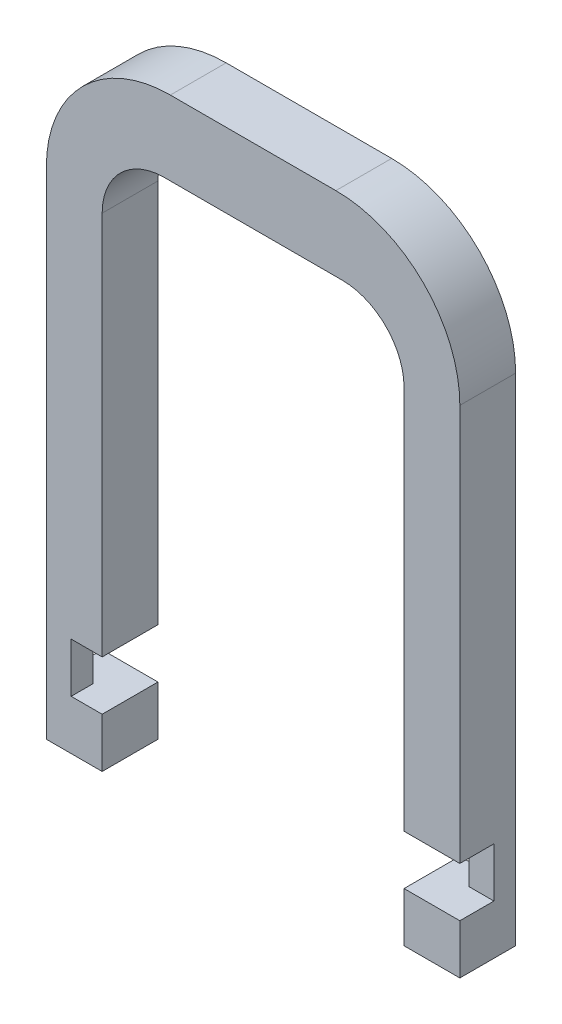
ISO-10303-21;
HEADER;
FILE_DESCRIPTION(('STEP AP214'),'2;1');
FILE_NAME('part.step','',(''),(''),'','','');
FILE_SCHEMA(('AUTOMOTIVE_DESIGN { 1 0 10303 214 1 1 1 1 }'));
ENDSEC;
DATA;
#1=APPLICATION_CONTEXT('core data for automotive mechanical design processes');
#2=APPLICATION_PROTOCOL_DEFINITION('international standard','automotive_design',2000,#1);
#3=PRODUCT_CONTEXT('',#1,'mechanical');
#4=PRODUCT('Part','Part','',(#3));
#5=PRODUCT_RELATED_PRODUCT_CATEGORY('part','',(#4));
#6=PRODUCT_DEFINITION_FORMATION('','',#4);
#7=PRODUCT_DEFINITION_CONTEXT('part definition',#1,'design');
#8=PRODUCT_DEFINITION('design','',#6,#7);
#9=PRODUCT_DEFINITION_SHAPE('','',#8);
#10=(LENGTH_UNIT() NAMED_UNIT(*) SI_UNIT(.MILLI.,.METRE.));
#11=(NAMED_UNIT(*) PLANE_ANGLE_UNIT() SI_UNIT($,.RADIAN.));
#12=(NAMED_UNIT(*) SI_UNIT($,.STERADIAN.) SOLID_ANGLE_UNIT());
#13=UNCERTAINTY_MEASURE_WITH_UNIT(LENGTH_MEASURE(1.E-05),#10,'distance_accuracy_value','');
#14=(GEOMETRIC_REPRESENTATION_CONTEXT(3) GLOBAL_UNCERTAINTY_ASSIGNED_CONTEXT((#13)) GLOBAL_UNIT_ASSIGNED_CONTEXT((#10,
#11,#12)) REPRESENTATION_CONTEXT('',''));
#15=CARTESIAN_POINT('',(0.,0.,0.));
#16=DIRECTION('',(0.,0.,1.));
#17=DIRECTION('',(1.,0.,0.));
#18=AXIS2_PLACEMENT_3D('',#15,#16,#17);
#19=CARTESIAN_POINT('',(-16.1410256410256,50.,-2.5));
#20=DIRECTION('',(-1.,0.,0.));
#21=DIRECTION('',(0.,0.,1.));
#22=AXIS2_PLACEMENT_3D('',#19,#20,#21);
#23=PLANE('',#22);
#24=DIRECTION('',(0.,-1.,0.));
#25=VECTOR('',#24,1.);
#26=CARTESIAN_POINT('',(-16.1410256410256,50.,2.));
#27=LINE('',#26,#25);
#28=CARTESIAN_POINT('',(-16.1410256410256,39.,2.));
#29=VERTEX_POINT('',#28);
#30=CARTESIAN_POINT('',(-16.1410256410256,8.,2.));
#31=VERTEX_POINT('',#30);
#32=EDGE_CURVE('E399',#29,#31,#27,.T.);
#33=ORIENTED_EDGE('',*,*,#32,.T.);
#34=DIRECTION('',(0.,0.,-1.));
#35=VECTOR('',#34,1.);
#36=CARTESIAN_POINT('',(-16.1410256410256,8.,0.25));
#37=LINE('',#36,#35);
#38=CARTESIAN_POINT('',(-16.1410256410256,8.,-2.5));
#39=VERTEX_POINT('',#38);
#40=EDGE_CURVE('E239',#31,#39,#37,.T.);
#41=ORIENTED_EDGE('',*,*,#40,.T.);
#42=DIRECTION('',(0.,-1.,0.));
#43=VECTOR('',#42,1.);
#44=CARTESIAN_POINT('',(-16.1410256410256,50.,-2.5));
#45=LINE('',#44,#43);
#46=CARTESIAN_POINT('',(-16.1410256410256,39.,-2.5));
#47=VERTEX_POINT('',#46);
#48=EDGE_CURVE('E359',#47,#39,#45,.T.);
#49=ORIENTED_EDGE('',*,*,#48,.F.);
#50=DIRECTION('',(0.,0.,-1.));
#51=VECTOR('',#50,1.);
#52=CARTESIAN_POINT('',(-16.1410256410256,39.,2.));
#53=LINE('',#52,#51);
#54=EDGE_CURVE('E322',#47,#29,#53,.F.);
#55=ORIENTED_EDGE('',*,*,#54,.T.);
#56=EDGE_LOOP('',(#33,#41,#49,#55));
#57=FACE_BOUND('',#56,.T.);
#58=ADVANCED_FACE('F33',(#57),#23,.F.);
#59=CARTESIAN_POINT('',(0.,0.,0.25));
#60=DIRECTION('',(0.,0.,-1.));
#61=DIRECTION('',(-1.,0.,0.));
#62=AXIS2_PLACEMENT_3D('',#59,#60,#61);
#63=PLANE('',#62);
#64=DIRECTION('',(1.,0.,0.));
#65=VECTOR('',#64,1.);
#66=CARTESIAN_POINT('',(-16.1410256410256,8.,0.25));
#67=LINE('',#66,#65);
#68=CARTESIAN_POINT('',(-20.6410256410256,8.,0.25));
#69=VERTEX_POINT('',#68);
#70=CARTESIAN_POINT('',(-18.6410256410256,8.,0.25));
#71=VERTEX_POINT('',#70);
#72=EDGE_CURVE('E233',#69,#71,#67,.T.);
#73=ORIENTED_EDGE('',*,*,#72,.T.);
#74=DIRECTION('',(0.,-1.,0.));
#75=VECTOR('',#74,1.);
#76=CARTESIAN_POINT('',(-18.6410256410256,0.,0.25));
#77=LINE('',#76,#75);
#78=CARTESIAN_POINT('',(-18.6410256410256,4.,0.25));
#79=VERTEX_POINT('',#78);
#80=EDGE_CURVE('E11',#71,#79,#77,.T.);
#81=ORIENTED_EDGE('',*,*,#80,.T.);
#82=DIRECTION('',(-1.,0.,0.));
#83=VECTOR('',#82,1.);
#84=CARTESIAN_POINT('',(-16.1410256410256,4.,0.25));
#85=LINE('',#84,#83);
#86=CARTESIAN_POINT('',(-20.6410256410256,4.,0.25));
#87=VERTEX_POINT('',#86);
#88=EDGE_CURVE('E198',#79,#87,#85,.T.);
#89=ORIENTED_EDGE('',*,*,#88,.T.);
#90=DIRECTION('',(0.,1.,0.));
#91=VECTOR('',#90,1.);
#92=CARTESIAN_POINT('',(-20.6410256410256,8.,0.25));
#93=LINE('',#92,#91);
#94=EDGE_CURVE('E230',#87,#69,#93,.T.);
#95=ORIENTED_EDGE('',*,*,#94,.T.);
#96=EDGE_LOOP('',(#73,#81,#89,#95));
#97=FACE_BOUND('',#96,.T.);
#98=ADVANCED_FACE('F440',(#97),#63,.T.);
#99=CARTESIAN_POINT('',(8.20897435897439,50.,-2.5));
#100=DIRECTION('',(1.,0.,0.));
#101=DIRECTION('',(0.,0.,-1.));
#102=AXIS2_PLACEMENT_3D('',#99,#100,#101);
#103=PLANE('',#102);
#104=DIRECTION('',(0.,-1.,0.));
#105=VECTOR('',#104,1.);
#106=CARTESIAN_POINT('',(8.20897435897439,50.,-2.5));
#107=LINE('',#106,#105);
#108=CARTESIAN_POINT('',(8.20897435897439,39.,-2.5));
#109=VERTEX_POINT('',#108);
#110=CARTESIAN_POINT('',(8.20897435897439,8.,-2.5));
#111=VERTEX_POINT('',#110);
#112=EDGE_CURVE('E301',#109,#111,#107,.T.);
#113=ORIENTED_EDGE('',*,*,#112,.T.);
#114=DIRECTION('',(0.,0.,1.));
#115=VECTOR('',#114,1.);
#116=CARTESIAN_POINT('',(8.20897435897439,8.,-0.75));
#117=LINE('',#116,#115);
#118=CARTESIAN_POINT('',(8.20897435897439,8.,2.));
#119=VERTEX_POINT('',#118);
#120=EDGE_CURVE('E260',#111,#119,#117,.T.);
#121=ORIENTED_EDGE('',*,*,#120,.T.);
#122=DIRECTION('',(0.,-1.,0.));
#123=VECTOR('',#122,1.);
#124=CARTESIAN_POINT('',(8.20897435897439,50.,2.));
#125=LINE('',#124,#123);
#126=CARTESIAN_POINT('',(8.20897435897439,39.,2.));
#127=VERTEX_POINT('',#126);
#128=EDGE_CURVE('E292',#127,#119,#125,.T.);
#129=ORIENTED_EDGE('',*,*,#128,.F.);
#130=DIRECTION('',(0.,0.,1.));
#131=VECTOR('',#130,1.);
#132=CARTESIAN_POINT('',(8.20897435897439,39.,-2.5));
#133=LINE('',#132,#131);
#134=EDGE_CURVE('E315',#127,#109,#133,.F.);
#135=ORIENTED_EDGE('',*,*,#134,.T.);
#136=EDGE_LOOP('',(#113,#121,#129,#135));
#137=FACE_BOUND('',#136,.T.);
#138=ADVANCED_FACE('F314',(#137),#103,.F.);
#139=CARTESIAN_POINT('',(-20.6410256410256,50.,-2.5));
#140=DIRECTION('',(0.,0.,1.));
#141=DIRECTION('',(1.,0.,0.));
#142=AXIS2_PLACEMENT_3D('',#139,#140,#141);
#143=PLANE('',#142);
#144=DIRECTION('',(0.,-1.,0.));
#145=VECTOR('',#144,1.);
#146=CARTESIAN_POINT('',(10.7089743589744,4.,-2.5));
#147=LINE('',#146,#145);
#148=CARTESIAN_POINT('',(10.7089743589744,8.,-2.5));
#149=VERTEX_POINT('',#148);
#150=CARTESIAN_POINT('',(10.7089743589744,4.,-2.5));
#151=VERTEX_POINT('',#150);
#152=EDGE_CURVE('E214',#149,#151,#147,.T.);
#153=ORIENTED_EDGE('',*,*,#152,.F.);
#154=DIRECTION('',(-1.,0.,0.));
#155=VECTOR('',#154,1.);
#156=CARTESIAN_POINT('',(10.7089743589744,8.,-2.5));
#157=LINE('',#156,#155);
#158=EDGE_CURVE('E223',#149,#111,#157,.T.);
#159=ORIENTED_EDGE('',*,*,#158,.T.);
#160=ORIENTED_EDGE('',*,*,#112,.F.);
#161=CARTESIAN_POINT('',(3.20897435897438,39.,-2.5));
#162=DIRECTION('',(0.,0.,1.));
#163=DIRECTION('',(1.,0.,0.));
#164=AXIS2_PLACEMENT_3D('',#161,#162,#163);
#165=CIRCLE('',#164,5.);
#166=CARTESIAN_POINT('',(3.20897435897438,44.,-2.5));
#167=VERTEX_POINT('',#166);
#168=EDGE_CURVE('E298',#109,#167,#165,.T.);
#169=ORIENTED_EDGE('',*,*,#168,.T.);
#170=DIRECTION('',(1.,0.,0.));
#171=VECTOR('',#170,1.);
#172=CARTESIAN_POINT('',(-16.7910256410256,44.,-2.49999999999999));
#173=LINE('',#172,#171);
#174=CARTESIAN_POINT('',(-11.1410256410256,44.,-2.5));
#175=VERTEX_POINT('',#174);
#176=EDGE_CURVE('E333',#175,#167,#173,.T.);
#177=ORIENTED_EDGE('',*,*,#176,.F.);
#178=CARTESIAN_POINT('',(-11.1410256410256,39.,-2.5));
#179=DIRECTION('',(0.,0.,1.));
#180=DIRECTION('',(1.,0.,0.));
#181=AXIS2_PLACEMENT_3D('',#178,#179,#180);
#182=CIRCLE('',#181,5.);
#183=EDGE_CURVE('E321',#175,#47,#182,.T.);
#184=ORIENTED_EDGE('',*,*,#183,.T.);
#185=ORIENTED_EDGE('',*,*,#48,.T.);
#186=DIRECTION('',(1.,0.,0.));
#187=VECTOR('',#186,1.);
#188=CARTESIAN_POINT('',(-16.1410256410256,8.,-2.5));
#189=LINE('',#188,#187);
#190=CARTESIAN_POINT('',(-20.6410256410256,8.,-2.5));
#191=VERTEX_POINT('',#190);
#192=EDGE_CURVE('E231',#191,#39,#189,.T.);
#193=ORIENTED_EDGE('',*,*,#192,.F.);
#194=DIRECTION('',(0.,-1.,0.));
#195=VECTOR('',#194,1.);
#196=CARTESIAN_POINT('',(-20.6410256410256,50.,-2.5));
#197=LINE('',#196,#195);
#198=CARTESIAN_POINT('',(-20.6410256410256,40.,-2.5));
#199=VERTEX_POINT('',#198);
#200=EDGE_CURVE('E377',#199,#191,#197,.T.);
#201=ORIENTED_EDGE('',*,*,#200,.F.);
#202=CARTESIAN_POINT('',(-10.6410256410256,40.,-2.5));
#203=DIRECTION('',(0.,0.,1.));
#204=DIRECTION('',(1.,0.,0.));
#205=AXIS2_PLACEMENT_3D('',#202,#203,#204);
#206=CIRCLE('',#205,10.);
#207=CARTESIAN_POINT('',(-10.6410256410256,50.,-2.5));
#208=VERTEX_POINT('',#207);
#209=EDGE_CURVE('E346',#199,#208,#206,.F.);
#210=ORIENTED_EDGE('',*,*,#209,.T.);
#211=DIRECTION('',(-1.,0.,0.));
#212=VECTOR('',#211,1.);
#213=CARTESIAN_POINT('',(-20.6410256410256,50.,-2.5));
#214=LINE('',#213,#212);
#215=CARTESIAN_POINT('',(2.70897435897439,50.,-2.5));
#216=VERTEX_POINT('',#215);
#217=EDGE_CURVE('E374',#216,#208,#214,.T.);
#218=ORIENTED_EDGE('',*,*,#217,.F.);
#219=CARTESIAN_POINT('',(2.70897435897439,40.,-2.5));
#220=DIRECTION('',(0.,0.,1.));
#221=DIRECTION('',(1.,0.,0.));
#222=AXIS2_PLACEMENT_3D('',#219,#220,#221);
#223=CIRCLE('',#222,10.);
#224=CARTESIAN_POINT('',(12.7089743589744,40.,-2.5));
#225=VERTEX_POINT('',#224);
#226=EDGE_CURVE('E368',#216,#225,#223,.F.);
#227=ORIENTED_EDGE('',*,*,#226,.T.);
#228=DIRECTION('',(0.,-1.,0.));
#229=VECTOR('',#228,1.);
#230=CARTESIAN_POINT('',(12.7089743589744,50.,-2.5));
#231=LINE('',#230,#229);
#232=CARTESIAN_POINT('',(12.7089743589744,0.,-2.5));
#233=VERTEX_POINT('',#232);
#234=EDGE_CURVE('E305',#225,#233,#231,.T.);
#235=ORIENTED_EDGE('',*,*,#234,.T.);
#236=DIRECTION('',(-1.,0.,0.));
#237=VECTOR('',#236,1.);
#238=CARTESIAN_POINT('',(8.20897435897439,0.,-2.5));
#239=LINE('',#238,#237);
#240=CARTESIAN_POINT('',(8.20897435897439,0.,-2.5));
#241=VERTEX_POINT('',#240);
#242=EDGE_CURVE('E272',#233,#241,#239,.T.);
#243=ORIENTED_EDGE('',*,*,#242,.T.);
#244=CARTESIAN_POINT('',(8.20897435897439,4.,-2.5));
#245=VERTEX_POINT('',#244);
#246=EDGE_CURVE('E300',#245,#241,#107,.T.);
#247=ORIENTED_EDGE('',*,*,#246,.F.);
#248=DIRECTION('',(-1.,0.,0.));
#249=VECTOR('',#248,1.);
#250=CARTESIAN_POINT('',(10.7089743589744,4.,-2.5));
#251=LINE('',#250,#249);
#252=EDGE_CURVE('E222',#151,#245,#251,.T.);
#253=ORIENTED_EDGE('',*,*,#252,.F.);
#254=EDGE_LOOP('',(#153,#159,#160,#169,#177,#184,#185,#193,#201,#210,#218,#227,#235,#243,#247,#253));
#255=FACE_BOUND('',#254,.T.);
#256=ADVANCED_FACE('F332',(#255),#143,.F.);
#257=CARTESIAN_POINT('',(-20.6410256410256,50.,2.));
#258=DIRECTION('',(0.,0.,-1.));
#259=DIRECTION('',(-1.,0.,0.));
#260=AXIS2_PLACEMENT_3D('',#257,#258,#259);
#261=PLANE('',#260);
#262=DIRECTION('',(0.,-1.,0.));
#263=VECTOR('',#262,1.);
#264=CARTESIAN_POINT('',(-18.6410256410256,8.,2.));
#265=LINE('',#264,#263);
#266=CARTESIAN_POINT('',(-18.6410256410256,8.,2.));
#267=VERTEX_POINT('',#266);
#268=CARTESIAN_POINT('',(-18.6410256410256,4.,2.));
#269=VERTEX_POINT('',#268);
#270=EDGE_CURVE('E200',#267,#269,#265,.T.);
#271=ORIENTED_EDGE('',*,*,#270,.F.);
#272=DIRECTION('',(1.,0.,0.));
#273=VECTOR('',#272,1.);
#274=CARTESIAN_POINT('',(-18.6410256410256,8.,2.));
#275=LINE('',#274,#273);
#276=EDGE_CURVE('E212',#267,#31,#275,.T.);
#277=ORIENTED_EDGE('',*,*,#276,.T.);
#278=ORIENTED_EDGE('',*,*,#32,.F.);
#279=CARTESIAN_POINT('',(-11.1410256410256,39.,2.));
#280=DIRECTION('',(0.,0.,-1.));
#281=DIRECTION('',(-1.,0.,0.));
#282=AXIS2_PLACEMENT_3D('',#279,#280,#281);
#283=CIRCLE('',#282,5.);
#284=CARTESIAN_POINT('',(-11.1410256410256,44.,2.));
#285=VERTEX_POINT('',#284);
#286=EDGE_CURVE('E323',#29,#285,#283,.T.);
#287=ORIENTED_EDGE('',*,*,#286,.T.);
#288=DIRECTION('',(1.,0.,0.));
#289=VECTOR('',#288,1.);
#290=CARTESIAN_POINT('',(-16.7910256410256,44.,2.));
#291=LINE('',#290,#289);
#292=CARTESIAN_POINT('',(3.20897435897438,44.,2.));
#293=VERTEX_POINT('',#292);
#294=EDGE_CURVE('E341',#285,#293,#291,.T.);
#295=ORIENTED_EDGE('',*,*,#294,.T.);
#296=CARTESIAN_POINT('',(3.20897435897438,39.,2.));
#297=DIRECTION('',(0.,0.,-1.));
#298=DIRECTION('',(-1.,0.,0.));
#299=AXIS2_PLACEMENT_3D('',#296,#297,#298);
#300=CIRCLE('',#299,5.);
#301=EDGE_CURVE('E311',#293,#127,#300,.T.);
#302=ORIENTED_EDGE('',*,*,#301,.T.);
#303=ORIENTED_EDGE('',*,*,#128,.T.);
#304=DIRECTION('',(-1.,0.,0.));
#305=VECTOR('',#304,1.);
#306=CARTESIAN_POINT('',(8.20897435897439,8.,2.));
#307=LINE('',#306,#305);
#308=CARTESIAN_POINT('',(12.7089743589744,8.,2.));
#309=VERTEX_POINT('',#308);
#310=EDGE_CURVE('E252',#309,#119,#307,.T.);
#311=ORIENTED_EDGE('',*,*,#310,.F.);
#312=DIRECTION('',(0.,-1.,0.));
#313=VECTOR('',#312,1.);
#314=CARTESIAN_POINT('',(12.7089743589744,50.,2.));
#315=LINE('',#314,#313);
#316=CARTESIAN_POINT('',(12.7089743589744,40.,2.));
#317=VERTEX_POINT('',#316);
#318=EDGE_CURVE('E282',#317,#309,#315,.T.);
#319=ORIENTED_EDGE('',*,*,#318,.F.);
#320=CARTESIAN_POINT('',(2.70897435897439,40.,2.));
#321=DIRECTION('',(0.,0.,-1.));
#322=DIRECTION('',(-1.,0.,0.));
#323=AXIS2_PLACEMENT_3D('',#320,#321,#322);
#324=CIRCLE('',#323,10.);
#325=CARTESIAN_POINT('',(2.70897435897439,50.,2.));
#326=VERTEX_POINT('',#325);
#327=EDGE_CURVE('E362',#317,#326,#324,.F.);
#328=ORIENTED_EDGE('',*,*,#327,.T.);
#329=DIRECTION('',(1.,0.,0.));
#330=VECTOR('',#329,1.);
#331=CARTESIAN_POINT('',(-20.6410256410256,50.,2.));
#332=LINE('',#331,#330);
#333=CARTESIAN_POINT('',(-10.6410256410256,50.,2.));
#334=VERTEX_POINT('',#333);
#335=EDGE_CURVE('E386',#334,#326,#332,.T.);
#336=ORIENTED_EDGE('',*,*,#335,.F.);
#337=CARTESIAN_POINT('',(-10.6410256410256,40.,2.));
#338=DIRECTION('',(0.,0.,-1.));
#339=DIRECTION('',(-1.,0.,0.));
#340=AXIS2_PLACEMENT_3D('',#337,#338,#339);
#341=CIRCLE('',#340,10.);
#342=CARTESIAN_POINT('',(-20.6410256410256,40.,2.));
#343=VERTEX_POINT('',#342);
#344=EDGE_CURVE('E364',#334,#343,#341,.F.);
#345=ORIENTED_EDGE('',*,*,#344,.T.);
#346=DIRECTION('',(0.,-1.,0.));
#347=VECTOR('',#346,1.);
#348=CARTESIAN_POINT('',(-20.6410256410256,50.,2.));
#349=LINE('',#348,#347);
#350=CARTESIAN_POINT('',(-20.6410256410256,0.,2.));
#351=VERTEX_POINT('',#350);
#352=EDGE_CURVE('E391',#343,#351,#349,.T.);
#353=ORIENTED_EDGE('',*,*,#352,.T.);
#354=DIRECTION('',(1.,0.,0.));
#355=VECTOR('',#354,1.);
#356=CARTESIAN_POINT('',(-20.6410256410256,0.,2.));
#357=LINE('',#356,#355);
#358=CARTESIAN_POINT('',(-16.1410256410256,0.,2.));
#359=VERTEX_POINT('',#358);
#360=EDGE_CURVE('E387',#351,#359,#357,.T.);
#361=ORIENTED_EDGE('',*,*,#360,.T.);
#362=CARTESIAN_POINT('',(-16.1410256410256,4.,2.));
#363=VERTEX_POINT('',#362);
#364=EDGE_CURVE('E211',#363,#359,#27,.T.);
#365=ORIENTED_EDGE('',*,*,#364,.F.);
#366=DIRECTION('',(1.,0.,0.));
#367=VECTOR('',#366,1.);
#368=CARTESIAN_POINT('',(-18.6410256410256,4.,2.));
#369=LINE('',#368,#367);
#370=EDGE_CURVE('E195',#269,#363,#369,.T.);
#371=ORIENTED_EDGE('',*,*,#370,.F.);
#372=EDGE_LOOP('',(#271,#277,#278,#287,#295,#302,#303,#311,#319,#328,#336,#345,#353,#361,#365,#371));
#373=FACE_BOUND('',#372,.T.);
#374=ADVANCED_FACE('F209',(#373),#261,.F.);
#375=DIRECTION('',(0.,0.,-1.));
#376=VECTOR('',#375,1.);
#377=CARTESIAN_POINT('',(-16.1410256410256,4.,0.25));
#378=LINE('',#377,#376);
#379=CARTESIAN_POINT('',(-16.1410256410256,4.,-2.5));
#380=VERTEX_POINT('',#379);
#381=EDGE_CURVE('E236',#363,#380,#378,.T.);
#382=ORIENTED_EDGE('',*,*,#381,.F.);
#383=ORIENTED_EDGE('',*,*,#364,.T.);
#384=DIRECTION('',(0.,0.,-1.));
#385=VECTOR('',#384,1.);
#386=CARTESIAN_POINT('',(-16.1410256410256,0.,-2.5));
#387=LINE('',#386,#385);
#388=CARTESIAN_POINT('',(-16.1410256410256,0.,-2.5));
#389=VERTEX_POINT('',#388);
#390=EDGE_CURVE('E340',#359,#389,#387,.T.);
#391=ORIENTED_EDGE('',*,*,#390,.T.);
#392=EDGE_CURVE('E405',#380,#389,#45,.T.);
#393=ORIENTED_EDGE('',*,*,#392,.F.);
#394=EDGE_LOOP('',(#382,#383,#391,#393));
#395=FACE_BOUND('',#394,.T.);
#396=ADVANCED_FACE('F422',(#395),#23,.F.);
#397=CARTESIAN_POINT('',(-20.6410256410256,4.,-2.5));
#398=VERTEX_POINT('',#397);
#399=CARTESIAN_POINT('',(-20.6410256410256,0.,-2.5));
#400=VERTEX_POINT('',#399);
#401=EDGE_CURVE('E398',#398,#400,#197,.T.);
#402=ORIENTED_EDGE('',*,*,#401,.F.);
#403=DIRECTION('',(-1.,0.,0.));
#404=VECTOR('',#403,1.);
#405=CARTESIAN_POINT('',(-16.1410256410256,4.,-2.5));
#406=LINE('',#405,#404);
#407=EDGE_CURVE('E226',#380,#398,#406,.T.);
#408=ORIENTED_EDGE('',*,*,#407,.F.);
#409=ORIENTED_EDGE('',*,*,#392,.T.);
#410=DIRECTION('',(-1.,0.,0.));
#411=VECTOR('',#410,1.);
#412=CARTESIAN_POINT('',(-20.6410256410256,0.,-2.5));
#413=LINE('',#412,#411);
#414=EDGE_CURVE('E415',#389,#400,#413,.T.);
#415=ORIENTED_EDGE('',*,*,#414,.T.);
#416=EDGE_LOOP('',(#402,#408,#409,#415));
#417=FACE_BOUND('',#416,.T.);
#418=ADVANCED_FACE('F414',(#417),#143,.F.);
#419=CARTESIAN_POINT('',(-20.6410256410256,50.,-2.5));
#420=DIRECTION('',(1.,0.,0.));
#421=DIRECTION('',(0.,0.,-1.));
#422=AXIS2_PLACEMENT_3D('',#419,#420,#421);
#423=PLANE('',#422);
#424=ORIENTED_EDGE('',*,*,#200,.T.);
#425=DIRECTION('',(0.,0.,-1.));
#426=VECTOR('',#425,1.);
#427=CARTESIAN_POINT('',(-20.6410256410256,8.,0.25));
#428=LINE('',#427,#426);
#429=EDGE_CURVE('E243',#69,#191,#428,.T.);
#430=ORIENTED_EDGE('',*,*,#429,.F.);
#431=ORIENTED_EDGE('',*,*,#94,.F.);
#432=DIRECTION('',(0.,0.,-1.));
#433=VECTOR('',#432,1.);
#434=CARTESIAN_POINT('',(-20.6410256410256,4.,0.25));
#435=LINE('',#434,#433);
#436=EDGE_CURVE('E245',#87,#398,#435,.T.);
#437=ORIENTED_EDGE('',*,*,#436,.T.);
#438=ORIENTED_EDGE('',*,*,#401,.T.);
#439=DIRECTION('',(0.,0.,1.));
#440=VECTOR('',#439,1.);
#441=CARTESIAN_POINT('',(-20.6410256410256,0.,-2.5));
#442=LINE('',#441,#440);
#443=EDGE_CURVE('E396',#400,#351,#442,.T.);
#444=ORIENTED_EDGE('',*,*,#443,.T.);
#445=ORIENTED_EDGE('',*,*,#352,.F.);
#446=DIRECTION('',(0.,0.,1.));
#447=VECTOR('',#446,1.);
#448=CARTESIAN_POINT('',(-20.6410256410256,40.,-2.5));
#449=LINE('',#448,#447);
#450=EDGE_CURVE('E366',#343,#199,#449,.F.);
#451=ORIENTED_EDGE('',*,*,#450,.T.);
#452=EDGE_LOOP('',(#424,#430,#431,#437,#438,#444,#445,#451));
#453=FACE_BOUND('',#452,.T.);
#454=ADVANCED_FACE('F394',(#453),#423,.F.);
#455=CARTESIAN_POINT('',(12.7089743589744,4.,2.));
#456=VERTEX_POINT('',#455);
#457=CARTESIAN_POINT('',(12.7089743589744,0.,2.));
#458=VERTEX_POINT('',#457);
#459=EDGE_CURVE('E281',#456,#458,#315,.T.);
#460=ORIENTED_EDGE('',*,*,#459,.F.);
#461=DIRECTION('',(1.,0.,0.));
#462=VECTOR('',#461,1.);
#463=CARTESIAN_POINT('',(8.20897435897439,4.,2.));
#464=LINE('',#463,#462);
#465=CARTESIAN_POINT('',(8.20897435897439,4.,2.));
#466=VERTEX_POINT('',#465);
#467=EDGE_CURVE('E242',#466,#456,#464,.T.);
#468=ORIENTED_EDGE('',*,*,#467,.F.);
#469=CARTESIAN_POINT('',(8.20897435897439,0.,2.));
#470=VERTEX_POINT('',#469);
#471=EDGE_CURVE('E285',#466,#470,#125,.T.);
#472=ORIENTED_EDGE('',*,*,#471,.T.);
#473=DIRECTION('',(1.,0.,0.));
#474=VECTOR('',#473,1.);
#475=CARTESIAN_POINT('',(8.20897435897439,0.,2.));
#476=LINE('',#475,#474);
#477=EDGE_CURVE('E278',#470,#458,#476,.T.);
#478=ORIENTED_EDGE('',*,*,#477,.T.);
#479=EDGE_LOOP('',(#460,#468,#472,#478));
#480=FACE_BOUND('',#479,.T.);
#481=ADVANCED_FACE('F483',(#480),#261,.F.);
#482=CARTESIAN_POINT('',(0.,50.,0.));
#483=DIRECTION('',(0.,1.,0.));
#484=DIRECTION('',(0.,0.,1.));
#485=AXIS2_PLACEMENT_3D('',#482,#483,#484);
#486=PLANE('',#485);
#487=ORIENTED_EDGE('',*,*,#217,.T.);
#488=DIRECTION('',(0.,0.,1.));
#489=VECTOR('',#488,1.);
#490=CARTESIAN_POINT('',(-10.6410256410256,50.,2.));
#491=LINE('',#490,#489);
#492=EDGE_CURVE('E358',#208,#334,#491,.T.);
#493=ORIENTED_EDGE('',*,*,#492,.T.);
#494=ORIENTED_EDGE('',*,*,#335,.T.);
#495=DIRECTION('',(0.,0.,-1.));
#496=VECTOR('',#495,1.);
#497=CARTESIAN_POINT('',(2.70897435897439,50.,-2.5));
#498=LINE('',#497,#496);
#499=EDGE_CURVE('E355',#326,#216,#498,.T.);
#500=ORIENTED_EDGE('',*,*,#499,.T.);
#501=EDGE_LOOP('',(#487,#493,#494,#500));
#502=FACE_BOUND('',#501,.T.);
#503=ADVANCED_FACE('F382',(#502),#486,.T.);
#504=CARTESIAN_POINT('',(0.,0.,0.));
#505=DIRECTION('',(0.,1.,0.));
#506=DIRECTION('',(0.,0.,1.));
#507=AXIS2_PLACEMENT_3D('',#504,#505,#506);
#508=PLANE('',#507);
#509=ORIENTED_EDGE('',*,*,#390,.F.);
#510=ORIENTED_EDGE('',*,*,#360,.F.);
#511=ORIENTED_EDGE('',*,*,#443,.F.);
#512=ORIENTED_EDGE('',*,*,#414,.F.);
#513=EDGE_LOOP('',(#509,#510,#511,#512));
#514=FACE_BOUND('',#513,.T.);
#515=ADVANCED_FACE('F420',(#514),#508,.F.);
#516=CARTESIAN_POINT('',(-16.7910256410256,44.,-2.49999999999999));
#517=DIRECTION('',(0.,1.,0.));
#518=DIRECTION('',(0.,0.,1.));
#519=AXIS2_PLACEMENT_3D('',#516,#517,#518);
#520=PLANE('',#519);
#521=ORIENTED_EDGE('',*,*,#294,.F.);
#522=DIRECTION('',(0.,0.,-1.));
#523=VECTOR('',#522,1.);
#524=CARTESIAN_POINT('',(-11.1410256410256,44.,-2.49999999999999));
#525=LINE('',#524,#523);
#526=EDGE_CURVE('E325',#285,#175,#525,.T.);
#527=ORIENTED_EDGE('',*,*,#526,.T.);
#528=ORIENTED_EDGE('',*,*,#176,.T.);
#529=DIRECTION('',(0.,0.,1.));
#530=VECTOR('',#529,1.);
#531=CARTESIAN_POINT('',(3.20897435897438,44.,2.));
#532=LINE('',#531,#530);
#533=EDGE_CURVE('E338',#167,#293,#532,.T.);
#534=ORIENTED_EDGE('',*,*,#533,.T.);
#535=EDGE_LOOP('',(#521,#527,#528,#534));
#536=FACE_BOUND('',#535,.T.);
#537=ADVANCED_FACE('F337',(#536),#520,.F.);
#538=CARTESIAN_POINT('',(12.7089743589744,50.,-2.5));
#539=DIRECTION('',(-1.,0.,0.));
#540=DIRECTION('',(0.,0.,1.));
#541=AXIS2_PLACEMENT_3D('',#538,#539,#540);
#542=PLANE('',#541);
#543=ORIENTED_EDGE('',*,*,#318,.T.);
#544=DIRECTION('',(0.,0.,1.));
#545=VECTOR('',#544,1.);
#546=CARTESIAN_POINT('',(12.7089743589744,8.,-0.75));
#547=LINE('',#546,#545);
#548=CARTESIAN_POINT('',(12.7089743589744,8.,-0.75));
#549=VERTEX_POINT('',#548);
#550=EDGE_CURVE('E264',#549,#309,#547,.T.);
#551=ORIENTED_EDGE('',*,*,#550,.F.);
#552=DIRECTION('',(0.,1.,0.));
#553=VECTOR('',#552,1.);
#554=CARTESIAN_POINT('',(12.7089743589744,8.,-0.75));
#555=LINE('',#554,#553);
#556=CARTESIAN_POINT('',(12.7089743589744,4.,-0.75));
#557=VERTEX_POINT('',#556);
#558=EDGE_CURVE('E251',#557,#549,#555,.T.);
#559=ORIENTED_EDGE('',*,*,#558,.F.);
#560=DIRECTION('',(0.,0.,1.));
#561=VECTOR('',#560,1.);
#562=CARTESIAN_POINT('',(12.7089743589744,4.,-0.75));
#563=LINE('',#562,#561);
#564=EDGE_CURVE('E266',#557,#456,#563,.T.);
#565=ORIENTED_EDGE('',*,*,#564,.T.);
#566=ORIENTED_EDGE('',*,*,#459,.T.);
#567=DIRECTION('',(0.,0.,-1.));
#568=VECTOR('',#567,1.);
#569=CARTESIAN_POINT('',(12.7089743589744,0.,-2.5));
#570=LINE('',#569,#568);
#571=EDGE_CURVE('E263',#458,#233,#570,.T.);
#572=ORIENTED_EDGE('',*,*,#571,.T.);
#573=ORIENTED_EDGE('',*,*,#234,.F.);
#574=DIRECTION('',(0.,0.,-1.));
#575=VECTOR('',#574,1.);
#576=CARTESIAN_POINT('',(12.7089743589744,40.,2.));
#577=LINE('',#576,#575);
#578=EDGE_CURVE('E343',#225,#317,#577,.F.);
#579=ORIENTED_EDGE('',*,*,#578,.T.);
#580=EDGE_LOOP('',(#543,#551,#559,#565,#566,#572,#573,#579));
#581=FACE_BOUND('',#580,.T.);
#582=ADVANCED_FACE('F475',(#581),#542,.F.);
#583=DIRECTION('',(0.,0.,1.));
#584=VECTOR('',#583,1.);
#585=CARTESIAN_POINT('',(8.20897435897439,4.,-0.75));
#586=LINE('',#585,#584);
#587=EDGE_CURVE('E257',#245,#466,#586,.T.);
#588=ORIENTED_EDGE('',*,*,#587,.F.);
#589=ORIENTED_EDGE('',*,*,#246,.T.);
#590=DIRECTION('',(0.,0.,1.));
#591=VECTOR('',#590,1.);
#592=CARTESIAN_POINT('',(8.20897435897439,0.,-2.5));
#593=LINE('',#592,#591);
#594=EDGE_CURVE('E275',#241,#470,#593,.T.);
#595=ORIENTED_EDGE('',*,*,#594,.T.);
#596=ORIENTED_EDGE('',*,*,#471,.F.);
#597=EDGE_LOOP('',(#588,#589,#595,#596));
#598=FACE_BOUND('',#597,.T.);
#599=ADVANCED_FACE('F448',(#598),#103,.F.);
#600=CARTESIAN_POINT('',(0.,0.,0.));
#601=DIRECTION('',(0.,1.,0.));
#602=DIRECTION('',(0.,0.,1.));
#603=AXIS2_PLACEMENT_3D('',#600,#601,#602);
#604=PLANE('',#603);
#605=ORIENTED_EDGE('',*,*,#571,.F.);
#606=ORIENTED_EDGE('',*,*,#477,.F.);
#607=ORIENTED_EDGE('',*,*,#594,.F.);
#608=ORIENTED_EDGE('',*,*,#242,.F.);
#609=EDGE_LOOP('',(#605,#606,#607,#608));
#610=FACE_BOUND('',#609,.T.);
#611=ADVANCED_FACE('F470',(#610),#604,.F.);
#612=CARTESIAN_POINT('',(-10.6410256410256,40.,0.));
#613=DIRECTION('',(0.,0.,-1.));
#614=DIRECTION('',(-1.,0.,0.));
#615=AXIS2_PLACEMENT_3D('',#612,#613,#614);
#616=CYLINDRICAL_SURFACE('',#615,10.);
#617=ORIENTED_EDGE('',*,*,#209,.F.);
#618=ORIENTED_EDGE('',*,*,#450,.F.);
#619=ORIENTED_EDGE('',*,*,#344,.F.);
#620=ORIENTED_EDGE('',*,*,#492,.F.);
#621=EDGE_LOOP('',(#617,#618,#619,#620));
#622=FACE_BOUND('',#621,.T.);
#623=ADVANCED_FACE('F389',(#622),#616,.T.);
#624=CARTESIAN_POINT('',(2.70897435897439,40.,0.));
#625=DIRECTION('',(0.,0.,1.));
#626=DIRECTION('',(1.,0.,0.));
#627=AXIS2_PLACEMENT_3D('',#624,#625,#626);
#628=CYLINDRICAL_SURFACE('',#627,10.);
#629=ORIENTED_EDGE('',*,*,#327,.F.);
#630=ORIENTED_EDGE('',*,*,#578,.F.);
#631=ORIENTED_EDGE('',*,*,#226,.F.);
#632=ORIENTED_EDGE('',*,*,#499,.F.);
#633=EDGE_LOOP('',(#629,#630,#631,#632));
#634=FACE_BOUND('',#633,.T.);
#635=ADVANCED_FACE('F496',(#634),#628,.T.);
#636=CARTESIAN_POINT('',(-11.1410256410256,39.,-2.49999999999999));
#637=DIRECTION('',(0.,0.,1.));
#638=DIRECTION('',(1.,0.,0.));
#639=AXIS2_PLACEMENT_3D('',#636,#637,#638);
#640=CYLINDRICAL_SURFACE('',#639,5.);
#641=ORIENTED_EDGE('',*,*,#286,.F.);
#642=ORIENTED_EDGE('',*,*,#54,.F.);
#643=ORIENTED_EDGE('',*,*,#183,.F.);
#644=ORIENTED_EDGE('',*,*,#526,.F.);
#645=EDGE_LOOP('',(#641,#642,#643,#644));
#646=FACE_BOUND('',#645,.T.);
#647=ADVANCED_FACE('F431',(#646),#640,.F.);
#648=CARTESIAN_POINT('',(3.20897435897438,39.,-2.49999999999999));
#649=DIRECTION('',(0.,0.,-1.));
#650=DIRECTION('',(-1.,0.,0.));
#651=AXIS2_PLACEMENT_3D('',#648,#649,#650);
#652=CYLINDRICAL_SURFACE('',#651,5.);
#653=ORIENTED_EDGE('',*,*,#168,.F.);
#654=ORIENTED_EDGE('',*,*,#134,.F.);
#655=ORIENTED_EDGE('',*,*,#301,.F.);
#656=ORIENTED_EDGE('',*,*,#533,.F.);
#657=EDGE_LOOP('',(#653,#654,#655,#656));
#658=FACE_BOUND('',#657,.T.);
#659=ADVANCED_FACE('F35',(#658),#652,.F.);
#660=CARTESIAN_POINT('',(8.20897435897439,8.,-0.75));
#661=DIRECTION('',(0.,1.,0.));
#662=DIRECTION('',(0.,0.,1.));
#663=AXIS2_PLACEMENT_3D('',#660,#661,#662);
#664=PLANE('',#663);
#665=ORIENTED_EDGE('',*,*,#310,.T.);
#666=ORIENTED_EDGE('',*,*,#120,.F.);
#667=ORIENTED_EDGE('',*,*,#158,.F.);
#668=DIRECTION('',(0.,0.,-1.));
#669=VECTOR('',#668,1.);
#670=CARTESIAN_POINT('',(10.7089743589744,8.,-2.5));
#671=LINE('',#670,#669);
#672=CARTESIAN_POINT('',(10.7089743589744,8.,-0.75));
#673=VERTEX_POINT('',#672);
#674=EDGE_CURVE('E220',#673,#149,#671,.T.);
#675=ORIENTED_EDGE('',*,*,#674,.F.);
#676=DIRECTION('',(-1.,0.,0.));
#677=VECTOR('',#676,1.);
#678=CARTESIAN_POINT('',(8.20897435897439,8.,-0.75));
#679=LINE('',#678,#677);
#680=EDGE_CURVE('E254',#549,#673,#679,.T.);
#681=ORIENTED_EDGE('',*,*,#680,.F.);
#682=ORIENTED_EDGE('',*,*,#550,.T.);
#683=EDGE_LOOP('',(#665,#666,#667,#675,#681,#682));
#684=FACE_BOUND('',#683,.T.);
#685=ADVANCED_FACE('F463',(#684),#664,.F.);
#686=CARTESIAN_POINT('',(8.20897435897439,4.,-0.75));
#687=DIRECTION('',(0.,-1.,0.));
#688=DIRECTION('',(0.,0.,-1.));
#689=AXIS2_PLACEMENT_3D('',#686,#687,#688);
#690=PLANE('',#689);
#691=DIRECTION('',(1.,0.,0.));
#692=VECTOR('',#691,1.);
#693=CARTESIAN_POINT('',(8.20897435897439,4.,-0.75));
#694=LINE('',#693,#692);
#695=CARTESIAN_POINT('',(10.7089743589744,4.,-0.75));
#696=VERTEX_POINT('',#695);
#697=EDGE_CURVE('E249',#696,#557,#694,.T.);
#698=ORIENTED_EDGE('',*,*,#697,.F.);
#699=DIRECTION('',(0.,0.,1.));
#700=VECTOR('',#699,1.);
#701=CARTESIAN_POINT('',(10.7089743589744,4.,-2.5));
#702=LINE('',#701,#700);
#703=EDGE_CURVE('E55',#151,#696,#702,.T.);
#704=ORIENTED_EDGE('',*,*,#703,.F.);
#705=ORIENTED_EDGE('',*,*,#252,.T.);
#706=ORIENTED_EDGE('',*,*,#587,.T.);
#707=ORIENTED_EDGE('',*,*,#467,.T.);
#708=ORIENTED_EDGE('',*,*,#564,.F.);
#709=EDGE_LOOP('',(#698,#704,#705,#706,#707,#708));
#710=FACE_BOUND('',#709,.T.);
#711=ADVANCED_FACE('F461',(#710),#690,.F.);
#712=CARTESIAN_POINT('',(0.,0.,-0.75));
#713=DIRECTION('',(0.,0.,1.));
#714=DIRECTION('',(1.,0.,0.));
#715=AXIS2_PLACEMENT_3D('',#712,#713,#714);
#716=PLANE('',#715);
#717=DIRECTION('',(0.,1.,0.));
#718=VECTOR('',#717,1.);
#719=CARTESIAN_POINT('',(10.7089743589744,0.,-0.75));
#720=LINE('',#719,#718);
#721=EDGE_CURVE('E41',#696,#673,#720,.T.);
#722=ORIENTED_EDGE('',*,*,#721,.F.);
#723=ORIENTED_EDGE('',*,*,#697,.T.);
#724=ORIENTED_EDGE('',*,*,#558,.T.);
#725=ORIENTED_EDGE('',*,*,#680,.T.);
#726=EDGE_LOOP('',(#722,#723,#724,#725));
#727=FACE_BOUND('',#726,.T.);
#728=ADVANCED_FACE('F456',(#727),#716,.T.);
#729=CARTESIAN_POINT('',(-16.1410256410256,8.,0.25));
#730=DIRECTION('',(0.,1.,0.));
#731=DIRECTION('',(0.,0.,1.));
#732=AXIS2_PLACEMENT_3D('',#729,#730,#731);
#733=PLANE('',#732);
#734=ORIENTED_EDGE('',*,*,#40,.F.);
#735=ORIENTED_EDGE('',*,*,#276,.F.);
#736=DIRECTION('',(0.,0.,1.));
#737=VECTOR('',#736,1.);
#738=CARTESIAN_POINT('',(-18.6410256410256,8.,2.));
#739=LINE('',#738,#737);
#740=EDGE_CURVE('E199',#71,#267,#739,.T.);
#741=ORIENTED_EDGE('',*,*,#740,.F.);
#742=ORIENTED_EDGE('',*,*,#72,.F.);
#743=ORIENTED_EDGE('',*,*,#429,.T.);
#744=ORIENTED_EDGE('',*,*,#192,.T.);
#745=EDGE_LOOP('',(#734,#735,#741,#742,#743,#744));
#746=FACE_BOUND('',#745,.T.);
#747=ADVANCED_FACE('F435',(#746),#733,.F.);
#748=CARTESIAN_POINT('',(-16.1410256410256,4.,0.25));
#749=DIRECTION('',(0.,-1.,0.));
#750=DIRECTION('',(0.,0.,-1.));
#751=AXIS2_PLACEMENT_3D('',#748,#749,#750);
#752=PLANE('',#751);
#753=ORIENTED_EDGE('',*,*,#407,.T.);
#754=ORIENTED_EDGE('',*,*,#436,.F.);
#755=ORIENTED_EDGE('',*,*,#88,.F.);
#756=DIRECTION('',(0.,0.,-1.));
#757=VECTOR('',#756,1.);
#758=CARTESIAN_POINT('',(-18.6410256410256,4.,2.));
#759=LINE('',#758,#757);
#760=EDGE_CURVE('E48',#269,#79,#759,.T.);
#761=ORIENTED_EDGE('',*,*,#760,.F.);
#762=ORIENTED_EDGE('',*,*,#370,.T.);
#763=ORIENTED_EDGE('',*,*,#381,.T.);
#764=EDGE_LOOP('',(#753,#754,#755,#761,#762,#763));
#765=FACE_BOUND('',#764,.T.);
#766=ADVANCED_FACE('F193',(#765),#752,.F.);
#767=CARTESIAN_POINT('',(10.7089743589744,0.,0.));
#768=DIRECTION('',(1.,0.,0.));
#769=DIRECTION('',(0.,0.,-1.));
#770=AXIS2_PLACEMENT_3D('',#767,#768,#769);
#771=PLANE('',#770);
#772=ORIENTED_EDGE('',*,*,#721,.T.);
#773=ORIENTED_EDGE('',*,*,#674,.T.);
#774=ORIENTED_EDGE('',*,*,#152,.T.);
#775=ORIENTED_EDGE('',*,*,#703,.T.);
#776=EDGE_LOOP('',(#772,#773,#774,#775));
#777=FACE_BOUND('',#776,.T.);
#778=ADVANCED_FACE('F452',(#777),#771,.F.);
#779=CARTESIAN_POINT('',(-18.6410256410256,0.,0.));
#780=DIRECTION('',(1.,0.,0.));
#781=DIRECTION('',(0.,0.,-1.));
#782=AXIS2_PLACEMENT_3D('',#779,#780,#781);
#783=PLANE('',#782);
#784=ORIENTED_EDGE('',*,*,#740,.T.);
#785=ORIENTED_EDGE('',*,*,#270,.T.);
#786=ORIENTED_EDGE('',*,*,#760,.T.);
#787=ORIENTED_EDGE('',*,*,#80,.F.);
#788=EDGE_LOOP('',(#784,#785,#786,#787));
#789=FACE_BOUND('',#788,.T.);
#790=ADVANCED_FACE('F203',(#789),#783,.T.);
#791=CLOSED_SHELL('',(#58,#98,#138,#256,#374,#396,#418,#454,#481,#503,#515,#537,#582,#599,#611,
#623,#635,#647,#659,#685,#711,#728,#747,#766,#778,#790));
#792=MANIFOLD_SOLID_BREP('B2',#791);
#793=ADVANCED_BREP_SHAPE_REPRESENTATION('',(#18,#792),#14);
#794=SHAPE_DEFINITION_REPRESENTATION(#9,#793);
ENDSEC;
END-ISO-10303-21;
